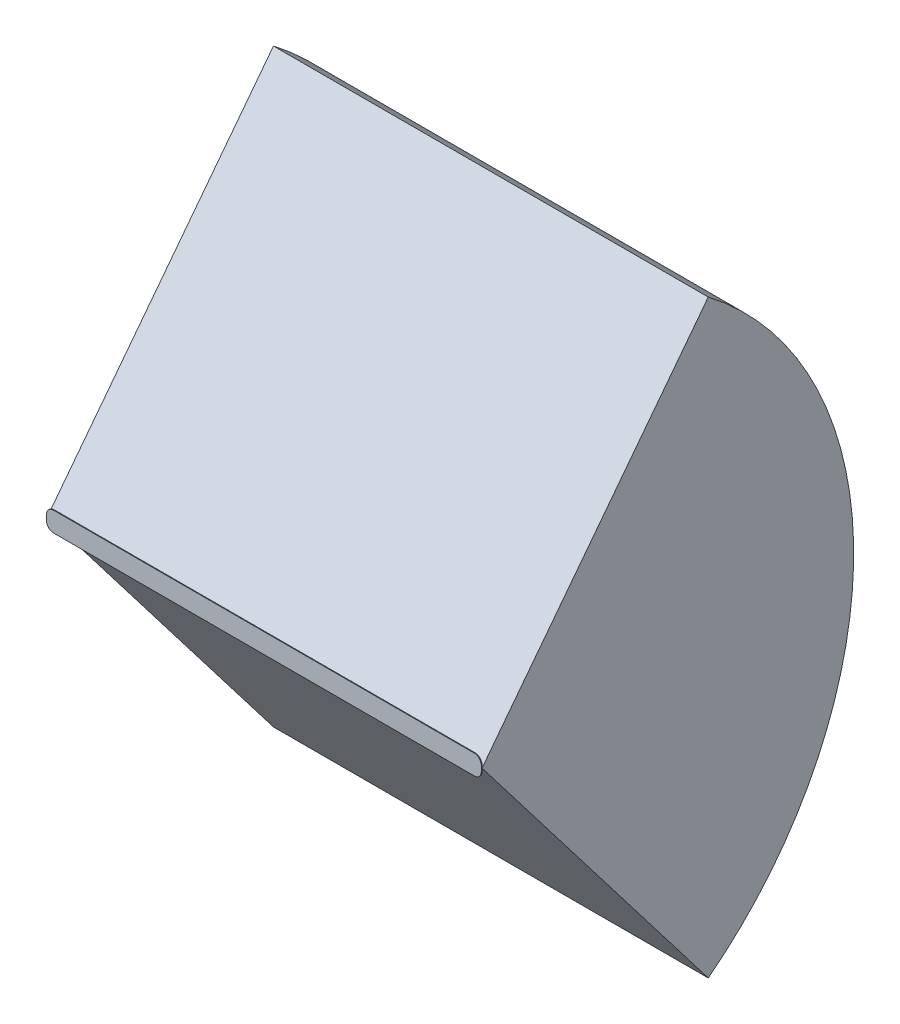
ISO-10303-21;
HEADER;
FILE_DESCRIPTION(('STEP AP214'),'2;1');
FILE_NAME('part.step','',(''),(''),'','','');
FILE_SCHEMA(('AUTOMOTIVE_DESIGN { 1 0 10303 214 1 1 1 1 }'));
ENDSEC;
DATA;
#1=APPLICATION_CONTEXT('core data for automotive mechanical design processes');
#2=APPLICATION_PROTOCOL_DEFINITION('international standard','automotive_design',2000,#1);
#3=PRODUCT_CONTEXT('',#1,'mechanical');
#4=PRODUCT('Part','Part','',(#3));
#5=PRODUCT_RELATED_PRODUCT_CATEGORY('part','',(#4));
#6=PRODUCT_DEFINITION_FORMATION('','',#4);
#7=PRODUCT_DEFINITION_CONTEXT('part definition',#1,'design');
#8=PRODUCT_DEFINITION('design','',#6,#7);
#9=PRODUCT_DEFINITION_SHAPE('','',#8);
#10=(LENGTH_UNIT() NAMED_UNIT(*) SI_UNIT(.MILLI.,.METRE.));
#11=(NAMED_UNIT(*) PLANE_ANGLE_UNIT() SI_UNIT($,.RADIAN.));
#12=(NAMED_UNIT(*) SI_UNIT($,.STERADIAN.) SOLID_ANGLE_UNIT());
#13=UNCERTAINTY_MEASURE_WITH_UNIT(LENGTH_MEASURE(1.E-05),#10,'distance_accuracy_value','');
#14=(GEOMETRIC_REPRESENTATION_CONTEXT(3) GLOBAL_UNCERTAINTY_ASSIGNED_CONTEXT((#13)) GLOBAL_UNIT_ASSIGNED_CONTEXT((#10,
#11,#12)) REPRESENTATION_CONTEXT('',''));
#15=CARTESIAN_POINT('',(0.,0.,0.));
#16=DIRECTION('',(0.,0.,1.));
#17=DIRECTION('',(1.,0.,0.));
#18=AXIS2_PLACEMENT_3D('',#15,#16,#17);
#19=CARTESIAN_POINT('',(-308.,0.,0.));
#20=DIRECTION('',(0.,-0.608761429008719,0.793353340291236));
#21=DIRECTION('',(0.,-0.793353340291236,-0.608761429008719));
#22=AXIS2_PLACEMENT_3D('',#19,#20,#21);
#23=PLANE('',#22);
#24=DIRECTION('',(0.,-0.793353340291236,-0.608761429008719));
#25=VECTOR('',#24,1.);
#26=CARTESIAN_POINT('',(308.,0.,0.));
#27=LINE('',#26,#25);
#28=CARTESIAN_POINT('',(308.,0.,0.));
#29=VERTEX_POINT('',#28);
#30=CARTESIAN_POINT('',(308.,-417.741352646021,-320.544213880126));
#31=VERTEX_POINT('',#30);
#32=EDGE_CURVE('E97',#29,#31,#27,.T.);
#33=ORIENTED_EDGE('',*,*,#32,.F.);
#34=DIRECTION('',(1.,0.,0.));
#35=VECTOR('',#34,1.);
#36=CARTESIAN_POINT('',(-308.,0.,0.));
#37=LINE('',#36,#35);
#38=CARTESIAN_POINT('',(-308.,0.,0.));
#39=VERTEX_POINT('',#38);
#40=EDGE_CURVE('E12',#39,#29,#37,.T.);
#41=ORIENTED_EDGE('',*,*,#40,.F.);
#42=DIRECTION('',(0.,-0.793353340291236,-0.608761429008719));
#43=VECTOR('',#42,1.);
#44=CARTESIAN_POINT('',(-308.,0.,0.));
#45=LINE('',#44,#43);
#46=CARTESIAN_POINT('',(-308.,-417.741352646021,-320.544213880126));
#47=VERTEX_POINT('',#46);
#48=EDGE_CURVE('E89',#39,#47,#45,.T.);
#49=ORIENTED_EDGE('',*,*,#48,.T.);
#50=DIRECTION('',(1.,0.,0.));
#51=VECTOR('',#50,1.);
#52=CARTESIAN_POINT('',(-308.,-417.741352646021,-320.544213880126));
#53=LINE('',#52,#51);
#54=EDGE_CURVE('E48',#47,#31,#53,.T.);
#55=ORIENTED_EDGE('',*,*,#54,.T.);
#56=EDGE_LOOP('',(#33,#41,#49,#55));
#57=FACE_BOUND('',#56,.T.);
#58=ADVANCED_FACE('F45',(#57),#23,.T.);
#59=CARTESIAN_POINT('',(-308.,0.,0.));
#60=DIRECTION('',(0.,0.608761429008719,0.793353340291236));
#61=DIRECTION('',(0.,-0.793353340291236,0.608761429008719));
#62=AXIS2_PLACEMENT_3D('',#59,#60,#61);
#63=PLANE('',#62);
#64=DIRECTION('',(0.,-0.793353340291236,0.608761429008719));
#65=VECTOR('',#64,1.);
#66=CARTESIAN_POINT('',(308.,0.,0.));
#67=LINE('',#66,#65);
#68=CARTESIAN_POINT('',(308.,417.741352646021,-320.544213880126));
#69=VERTEX_POINT('',#68);
#70=EDGE_CURVE('E91',#69,#29,#67,.T.);
#71=ORIENTED_EDGE('',*,*,#70,.F.);
#72=DIRECTION('',(1.,0.,0.));
#73=VECTOR('',#72,1.);
#74=CARTESIAN_POINT('',(-308.,417.741352646021,-320.544213880126));
#75=LINE('',#74,#73);
#76=CARTESIAN_POINT('',(-308.,417.741352646021,-320.544213880126));
#77=VERTEX_POINT('',#76);
#78=EDGE_CURVE('E54',#77,#69,#75,.T.);
#79=ORIENTED_EDGE('',*,*,#78,.F.);
#80=DIRECTION('',(0.,-0.793353340291236,0.608761429008719));
#81=VECTOR('',#80,1.);
#82=CARTESIAN_POINT('',(-308.,0.,0.));
#83=LINE('',#82,#81);
#84=EDGE_CURVE('E86',#77,#39,#83,.T.);
#85=ORIENTED_EDGE('',*,*,#84,.T.);
#86=ORIENTED_EDGE('',*,*,#40,.T.);
#87=EDGE_LOOP('',(#71,#79,#85,#86));
#88=FACE_BOUND('',#87,.T.);
#89=ADVANCED_FACE('F101',(#88),#63,.T.);
#90=CARTESIAN_POINT('',(-308.,0.,0.));
#91=DIRECTION('',(1.,0.,0.));
#92=DIRECTION('',(0.,0.,-1.));
#93=AXIS2_PLACEMENT_3D('',#90,#91,#92);
#94=CYLINDRICAL_SURFACE('',#93,526.551451201642);
#95=CARTESIAN_POINT('',(308.,0.,0.));
#96=DIRECTION('',(1.,0.,0.));
#97=DIRECTION('',(0.,0.,-1.));
#98=AXIS2_PLACEMENT_3D('',#95,#96,#97);
#99=CIRCLE('',#98,526.551451201642);
#100=EDGE_CURVE('E84',#31,#69,#99,.T.);
#101=ORIENTED_EDGE('',*,*,#100,.F.);
#102=ORIENTED_EDGE('',*,*,#54,.F.);
#103=CARTESIAN_POINT('',(-308.,0.,0.));
#104=DIRECTION('',(1.,0.,0.));
#105=DIRECTION('',(0.,0.,-1.));
#106=AXIS2_PLACEMENT_3D('',#103,#104,#105);
#107=CIRCLE('',#106,526.551451201642);
#108=EDGE_CURVE('E82',#47,#77,#107,.T.);
#109=ORIENTED_EDGE('',*,*,#108,.T.);
#110=ORIENTED_EDGE('',*,*,#78,.T.);
#111=EDGE_LOOP('',(#101,#102,#109,#110));
#112=FACE_BOUND('',#111,.T.);
#113=ADVANCED_FACE('F81',(#112),#94,.T.);
#114=CARTESIAN_POINT('',(-308.,0.,0.));
#115=DIRECTION('',(1.,0.,0.));
#116=DIRECTION('',(0.,0.,-1.));
#117=AXIS2_PLACEMENT_3D('',#114,#115,#116);
#118=PLANE('',#117);
#119=ORIENTED_EDGE('',*,*,#48,.F.);
#120=ORIENTED_EDGE('',*,*,#84,.F.);
#121=ORIENTED_EDGE('',*,*,#108,.F.);
#122=EDGE_LOOP('',(#119,#120,#121));
#123=FACE_BOUND('',#122,.T.);
#124=ADVANCED_FACE('F88',(#123),#118,.F.);
#125=CARTESIAN_POINT('',(308.,0.,0.));
#126=DIRECTION('',(1.,0.,0.));
#127=DIRECTION('',(0.,0.,-1.));
#128=AXIS2_PLACEMENT_3D('',#125,#126,#127);
#129=PLANE('',#128);
#130=ORIENTED_EDGE('',*,*,#32,.T.);
#131=ORIENTED_EDGE('',*,*,#100,.T.);
#132=ORIENTED_EDGE('',*,*,#70,.T.);
#133=EDGE_LOOP('',(#130,#131,#132));
#134=FACE_BOUND('',#133,.T.);
#135=ADVANCED_FACE('F100',(#134),#129,.T.);
#136=CLOSED_SHELL('',(#58,#89,#113,#124,#135));
#137=MANIFOLD_SOLID_BREP('B2',#136);
#138=CARTESIAN_POINT('',(-298.,-4.,1.));
#139=DIRECTION('',(0.,0.,-1.));
#140=DIRECTION('',(-1.,0.,0.));
#141=AXIS2_PLACEMENT_3D('',#138,#139,#140);
#142=CYLINDRICAL_SURFACE('',#141,10.);
#143=CARTESIAN_POINT('',(-298.,-4.,0.));
#144=DIRECTION('',(0.,0.,1.));
#145=DIRECTION('',(-1.,0.,0.));
#146=AXIS2_PLACEMENT_3D('',#143,#144,#145);
#147=CIRCLE('',#146,10.);
#148=CARTESIAN_POINT('',(-308.,-4.,0.));
#149=VERTEX_POINT('',#148);
#150=CARTESIAN_POINT('',(-298.,-14.,0.));
#151=VERTEX_POINT('',#150);
#152=EDGE_CURVE('E239',#149,#151,#147,.T.);
#153=ORIENTED_EDGE('',*,*,#152,.T.);
#154=DIRECTION('',(0.,0.,-1.));
#155=VECTOR('',#154,1.);
#156=CARTESIAN_POINT('',(-298.,-14.,1.));
#157=LINE('',#156,#155);
#158=CARTESIAN_POINT('',(-298.,-14.,1.));
#159=VERTEX_POINT('',#158);
#160=EDGE_CURVE('E43',#159,#151,#157,.T.);
#161=ORIENTED_EDGE('',*,*,#160,.F.);
#162=CARTESIAN_POINT('',(-298.,-4.,1.));
#163=DIRECTION('',(0.,0.,1.));
#164=DIRECTION('',(-1.,0.,0.));
#165=AXIS2_PLACEMENT_3D('',#162,#163,#164);
#166=CIRCLE('',#165,10.);
#167=CARTESIAN_POINT('',(-308.,-4.,1.));
#168=VERTEX_POINT('',#167);
#169=EDGE_CURVE('E253',#168,#159,#166,.T.);
#170=ORIENTED_EDGE('',*,*,#169,.F.);
#171=DIRECTION('',(0.,0.,-1.));
#172=VECTOR('',#171,1.);
#173=CARTESIAN_POINT('',(-308.,-4.,1.));
#174=LINE('',#173,#172);
#175=EDGE_CURVE('E235',#168,#149,#174,.T.);
#176=ORIENTED_EDGE('',*,*,#175,.T.);
#177=EDGE_LOOP('',(#153,#161,#170,#176));
#178=FACE_BOUND('',#177,.T.);
#179=ADVANCED_FACE('F143',(#178),#142,.T.);
#180=CARTESIAN_POINT('',(-298.,-14.,1.));
#181=DIRECTION('',(0.,1.,0.));
#182=DIRECTION('',(0.,0.,1.));
#183=AXIS2_PLACEMENT_3D('',#180,#181,#182);
#184=PLANE('',#183);
#185=DIRECTION('',(1.,0.,0.));
#186=VECTOR('',#185,1.);
#187=CARTESIAN_POINT('',(-298.,-14.,0.));
#188=LINE('',#187,#186);
#189=CARTESIAN_POINT('',(298.,-14.,0.));
#190=VERTEX_POINT('',#189);
#191=EDGE_CURVE('E242',#151,#190,#188,.T.);
#192=ORIENTED_EDGE('',*,*,#191,.T.);
#193=DIRECTION('',(0.,0.,-1.));
#194=VECTOR('',#193,1.);
#195=CARTESIAN_POINT('',(298.,-14.,1.));
#196=LINE('',#195,#194);
#197=CARTESIAN_POINT('',(298.,-14.,1.));
#198=VERTEX_POINT('',#197);
#199=EDGE_CURVE('E151',#198,#190,#196,.T.);
#200=ORIENTED_EDGE('',*,*,#199,.F.);
#201=DIRECTION('',(1.,0.,0.));
#202=VECTOR('',#201,1.);
#203=CARTESIAN_POINT('',(-298.,-14.,1.));
#204=LINE('',#203,#202);
#205=EDGE_CURVE('E202',#159,#198,#204,.T.);
#206=ORIENTED_EDGE('',*,*,#205,.F.);
#207=ORIENTED_EDGE('',*,*,#160,.T.);
#208=EDGE_LOOP('',(#192,#200,#206,#207));
#209=FACE_BOUND('',#208,.T.);
#210=ADVANCED_FACE('F288',(#209),#184,.F.);
#211=CARTESIAN_POINT('',(298.,-4.,1.));
#212=DIRECTION('',(0.,0.,-1.));
#213=DIRECTION('',(-1.,0.,0.));
#214=AXIS2_PLACEMENT_3D('',#211,#212,#213);
#215=CYLINDRICAL_SURFACE('',#214,10.);
#216=CARTESIAN_POINT('',(298.,-4.,0.));
#217=DIRECTION('',(0.,0.,1.));
#218=DIRECTION('',(1.,0.,0.));
#219=AXIS2_PLACEMENT_3D('',#216,#217,#218);
#220=CIRCLE('',#219,10.);
#221=CARTESIAN_POINT('',(308.,-4.,0.));
#222=VERTEX_POINT('',#221);
#223=EDGE_CURVE('E244',#190,#222,#220,.T.);
#224=ORIENTED_EDGE('',*,*,#223,.T.);
#225=DIRECTION('',(0.,0.,-1.));
#226=VECTOR('',#225,1.);
#227=CARTESIAN_POINT('',(308.,-4.,1.));
#228=LINE('',#227,#226);
#229=CARTESIAN_POINT('',(308.,-4.,1.));
#230=VERTEX_POINT('',#229);
#231=EDGE_CURVE('E260',#230,#222,#228,.T.);
#232=ORIENTED_EDGE('',*,*,#231,.F.);
#233=CARTESIAN_POINT('',(298.,-4.,1.));
#234=DIRECTION('',(0.,0.,1.));
#235=DIRECTION('',(1.,0.,0.));
#236=AXIS2_PLACEMENT_3D('',#233,#234,#235);
#237=CIRCLE('',#236,10.);
#238=EDGE_CURVE('E268',#198,#230,#237,.T.);
#239=ORIENTED_EDGE('',*,*,#238,.F.);
#240=ORIENTED_EDGE('',*,*,#199,.T.);
#241=EDGE_LOOP('',(#224,#232,#239,#240));
#242=FACE_BOUND('',#241,.T.);
#243=ADVANCED_FACE('F266',(#242),#215,.T.);
#244=CARTESIAN_POINT('',(308.,-4.,1.));
#245=DIRECTION('',(-1.,0.,0.));
#246=DIRECTION('',(0.,0.,1.));
#247=AXIS2_PLACEMENT_3D('',#244,#245,#246);
#248=PLANE('',#247);
#249=DIRECTION('',(0.,1.,0.));
#250=VECTOR('',#249,1.);
#251=CARTESIAN_POINT('',(308.,-4.,0.));
#252=LINE('',#251,#250);
#253=CARTESIAN_POINT('',(308.,4.,0.));
#254=VERTEX_POINT('',#253);
#255=EDGE_CURVE('E246',#222,#254,#252,.T.);
#256=ORIENTED_EDGE('',*,*,#255,.T.);
#257=DIRECTION('',(0.,0.,-1.));
#258=VECTOR('',#257,1.);
#259=CARTESIAN_POINT('',(308.,4.,1.));
#260=LINE('',#259,#258);
#261=CARTESIAN_POINT('',(308.,4.,1.));
#262=VERTEX_POINT('',#261);
#263=EDGE_CURVE('E257',#262,#254,#260,.T.);
#264=ORIENTED_EDGE('',*,*,#263,.F.);
#265=DIRECTION('',(0.,1.,0.));
#266=VECTOR('',#265,1.);
#267=CARTESIAN_POINT('',(308.,-4.,1.));
#268=LINE('',#267,#266);
#269=EDGE_CURVE('E280',#230,#262,#268,.T.);
#270=ORIENTED_EDGE('',*,*,#269,.F.);
#271=ORIENTED_EDGE('',*,*,#231,.T.);
#272=EDGE_LOOP('',(#256,#264,#270,#271));
#273=FACE_BOUND('',#272,.T.);
#274=ADVANCED_FACE('F276',(#273),#248,.F.);
#275=CARTESIAN_POINT('',(298.,4.,1.));
#276=DIRECTION('',(0.,0.,-1.));
#277=DIRECTION('',(-1.,0.,0.));
#278=AXIS2_PLACEMENT_3D('',#275,#276,#277);
#279=CYLINDRICAL_SURFACE('',#278,10.);
#280=CARTESIAN_POINT('',(298.,4.,0.));
#281=DIRECTION('',(0.,0.,1.));
#282=DIRECTION('',(1.,0.,0.));
#283=AXIS2_PLACEMENT_3D('',#280,#281,#282);
#284=CIRCLE('',#283,10.);
#285=CARTESIAN_POINT('',(298.,14.,0.));
#286=VERTEX_POINT('',#285);
#287=EDGE_CURVE('E248',#254,#286,#284,.T.);
#288=ORIENTED_EDGE('',*,*,#287,.T.);
#289=DIRECTION('',(0.,0.,-1.));
#290=VECTOR('',#289,1.);
#291=CARTESIAN_POINT('',(298.,14.,1.));
#292=LINE('',#291,#290);
#293=CARTESIAN_POINT('',(298.,14.,1.));
#294=VERTEX_POINT('',#293);
#295=EDGE_CURVE('E230',#294,#286,#292,.T.);
#296=ORIENTED_EDGE('',*,*,#295,.F.);
#297=CARTESIAN_POINT('',(298.,4.,1.));
#298=DIRECTION('',(0.,0.,1.));
#299=DIRECTION('',(1.,0.,0.));
#300=AXIS2_PLACEMENT_3D('',#297,#298,#299);
#301=CIRCLE('',#300,10.);
#302=EDGE_CURVE('E221',#262,#294,#301,.T.);
#303=ORIENTED_EDGE('',*,*,#302,.F.);
#304=ORIENTED_EDGE('',*,*,#263,.T.);
#305=EDGE_LOOP('',(#288,#296,#303,#304));
#306=FACE_BOUND('',#305,.T.);
#307=ADVANCED_FACE('F279',(#306),#279,.T.);
#308=CARTESIAN_POINT('',(-298.,14.,1.));
#309=DIRECTION('',(0.,-1.,0.));
#310=DIRECTION('',(0.,0.,-1.));
#311=AXIS2_PLACEMENT_3D('',#308,#309,#310);
#312=PLANE('',#311);
#313=DIRECTION('',(-1.,0.,0.));
#314=VECTOR('',#313,1.);
#315=CARTESIAN_POINT('',(-298.,14.,0.));
#316=LINE('',#315,#314);
#317=CARTESIAN_POINT('',(-298.,14.,0.));
#318=VERTEX_POINT('',#317);
#319=EDGE_CURVE('E229',#286,#318,#316,.T.);
#320=ORIENTED_EDGE('',*,*,#319,.T.);
#321=DIRECTION('',(0.,0.,-1.));
#322=VECTOR('',#321,1.);
#323=CARTESIAN_POINT('',(-298.,14.,1.));
#324=LINE('',#323,#322);
#325=CARTESIAN_POINT('',(-298.,14.,1.));
#326=VERTEX_POINT('',#325);
#327=EDGE_CURVE('E226',#326,#318,#324,.T.);
#328=ORIENTED_EDGE('',*,*,#327,.F.);
#329=DIRECTION('',(-1.,0.,0.));
#330=VECTOR('',#329,1.);
#331=CARTESIAN_POINT('',(-298.,14.,1.));
#332=LINE('',#331,#330);
#333=EDGE_CURVE('E215',#294,#326,#332,.T.);
#334=ORIENTED_EDGE('',*,*,#333,.F.);
#335=ORIENTED_EDGE('',*,*,#295,.T.);
#336=EDGE_LOOP('',(#320,#328,#334,#335));
#337=FACE_BOUND('',#336,.T.);
#338=ADVANCED_FACE('F227',(#337),#312,.F.);
#339=CARTESIAN_POINT('',(-298.,4.,1.));
#340=DIRECTION('',(0.,0.,-1.));
#341=DIRECTION('',(-1.,0.,0.));
#342=AXIS2_PLACEMENT_3D('',#339,#340,#341);
#343=CYLINDRICAL_SURFACE('',#342,10.);
#344=CARTESIAN_POINT('',(-298.,4.,0.));
#345=DIRECTION('',(0.,0.,1.));
#346=DIRECTION('',(-1.,0.,0.));
#347=AXIS2_PLACEMENT_3D('',#344,#345,#346);
#348=CIRCLE('',#347,10.);
#349=CARTESIAN_POINT('',(-308.,4.,0.));
#350=VERTEX_POINT('',#349);
#351=EDGE_CURVE('E188',#318,#350,#348,.T.);
#352=ORIENTED_EDGE('',*,*,#351,.T.);
#353=DIRECTION('',(0.,0.,-1.));
#354=VECTOR('',#353,1.);
#355=CARTESIAN_POINT('',(-308.,4.,1.));
#356=LINE('',#355,#354);
#357=CARTESIAN_POINT('',(-308.,4.,1.));
#358=VERTEX_POINT('',#357);
#359=EDGE_CURVE('E231',#358,#350,#356,.T.);
#360=ORIENTED_EDGE('',*,*,#359,.F.);
#361=CARTESIAN_POINT('',(-298.,4.,1.));
#362=DIRECTION('',(0.,0.,1.));
#363=DIRECTION('',(-1.,0.,0.));
#364=AXIS2_PLACEMENT_3D('',#361,#362,#363);
#365=CIRCLE('',#364,10.);
#366=EDGE_CURVE('E219',#326,#358,#365,.T.);
#367=ORIENTED_EDGE('',*,*,#366,.F.);
#368=ORIENTED_EDGE('',*,*,#327,.T.);
#369=EDGE_LOOP('',(#352,#360,#367,#368));
#370=FACE_BOUND('',#369,.T.);
#371=ADVANCED_FACE('F233',(#370),#343,.T.);
#372=CARTESIAN_POINT('',(-308.,-4.,1.));
#373=DIRECTION('',(1.,0.,0.));
#374=DIRECTION('',(0.,0.,-1.));
#375=AXIS2_PLACEMENT_3D('',#372,#373,#374);
#376=PLANE('',#375);
#377=DIRECTION('',(0.,-1.,0.));
#378=VECTOR('',#377,1.);
#379=CARTESIAN_POINT('',(-308.,-4.,0.));
#380=LINE('',#379,#378);
#381=EDGE_CURVE('E194',#350,#149,#380,.T.);
#382=ORIENTED_EDGE('',*,*,#381,.T.);
#383=ORIENTED_EDGE('',*,*,#175,.F.);
#384=DIRECTION('',(0.,-1.,0.));
#385=VECTOR('',#384,1.);
#386=CARTESIAN_POINT('',(-308.,-4.,1.));
#387=LINE('',#386,#385);
#388=EDGE_CURVE('E159',#358,#168,#387,.T.);
#389=ORIENTED_EDGE('',*,*,#388,.F.);
#390=ORIENTED_EDGE('',*,*,#359,.T.);
#391=EDGE_LOOP('',(#382,#383,#389,#390));
#392=FACE_BOUND('',#391,.T.);
#393=ADVANCED_FACE('F304',(#392),#376,.F.);
#394=CARTESIAN_POINT('',(-298.,-4.,1.));
#395=DIRECTION('',(0.,0.,-1.));
#396=DIRECTION('',(-1.,0.,0.));
#397=AXIS2_PLACEMENT_3D('',#394,#395,#396);
#398=PLANE('',#397);
#399=ORIENTED_EDGE('',*,*,#169,.T.);
#400=ORIENTED_EDGE('',*,*,#205,.T.);
#401=ORIENTED_EDGE('',*,*,#238,.T.);
#402=ORIENTED_EDGE('',*,*,#269,.T.);
#403=ORIENTED_EDGE('',*,*,#302,.T.);
#404=ORIENTED_EDGE('',*,*,#333,.T.);
#405=ORIENTED_EDGE('',*,*,#366,.T.);
#406=ORIENTED_EDGE('',*,*,#388,.T.);
#407=EDGE_LOOP('',(#399,#400,#401,#402,#403,#404,#405,#406));
#408=FACE_BOUND('',#407,.T.);
#409=ADVANCED_FACE('F217',(#408),#398,.F.);
#410=CARTESIAN_POINT('',(-298.,-4.,0.));
#411=DIRECTION('',(0.,0.,-1.));
#412=DIRECTION('',(-1.,0.,0.));
#413=AXIS2_PLACEMENT_3D('',#410,#411,#412);
#414=PLANE('',#413);
#415=ORIENTED_EDGE('',*,*,#152,.F.);
#416=ORIENTED_EDGE('',*,*,#381,.F.);
#417=ORIENTED_EDGE('',*,*,#351,.F.);
#418=ORIENTED_EDGE('',*,*,#319,.F.);
#419=ORIENTED_EDGE('',*,*,#287,.F.);
#420=ORIENTED_EDGE('',*,*,#255,.F.);
#421=ORIENTED_EDGE('',*,*,#223,.F.);
#422=ORIENTED_EDGE('',*,*,#191,.F.);
#423=EDGE_LOOP('',(#415,#416,#417,#418,#419,#420,#421,#422));
#424=FACE_BOUND('',#423,.T.);
#425=ADVANCED_FACE('F272',(#424),#414,.T.);
#426=CLOSED_SHELL('',(#179,#210,#243,#274,#307,#338,#371,#393,#409,#425));
#427=MANIFOLD_SOLID_BREP('B6',#426);
#428=ADVANCED_BREP_SHAPE_REPRESENTATION('',(#18,#137,#427),#14);
#429=SHAPE_DEFINITION_REPRESENTATION(#9,#428);
ENDSEC;
END-ISO-10303-21;
